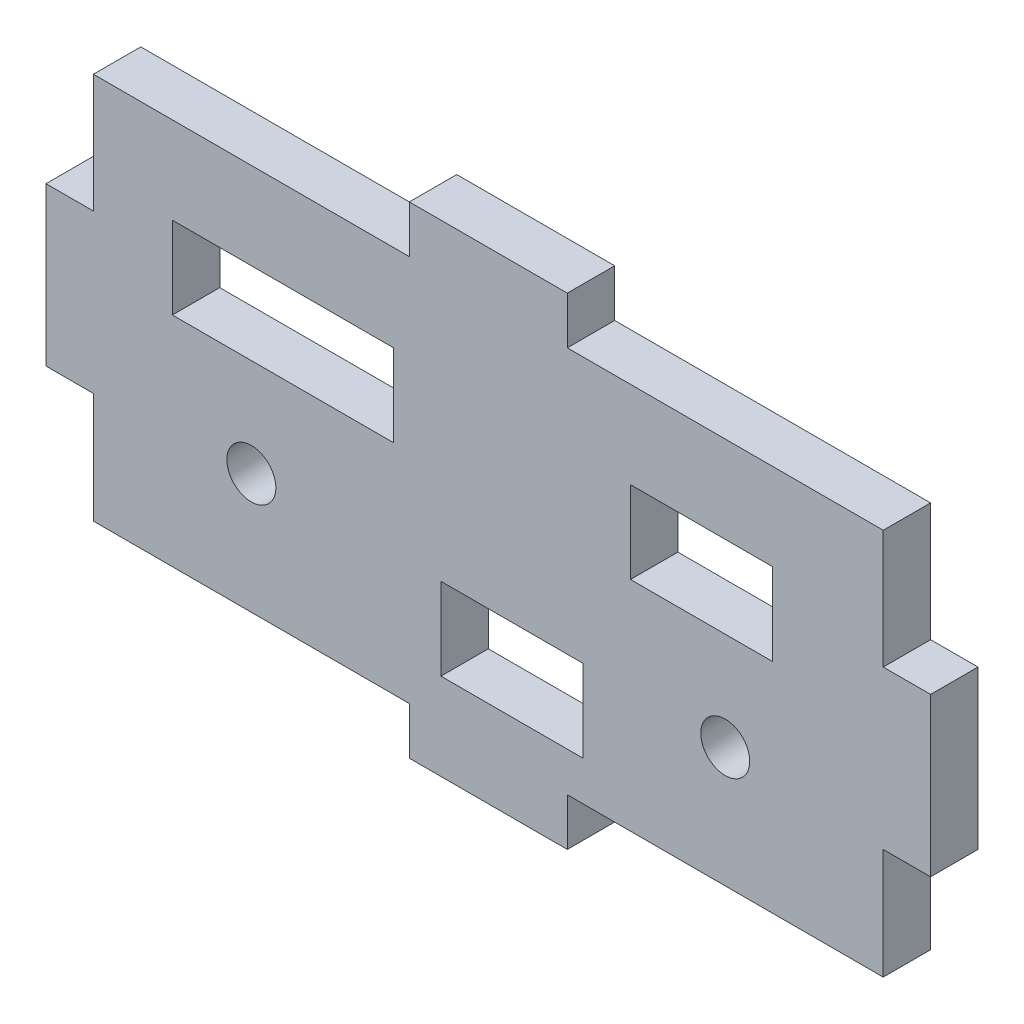
ISO-10303-21;
HEADER;
FILE_DESCRIPTION(('STEP AP214'),'2;1');
FILE_NAME('part.step','',(''),(''),'','','');
FILE_SCHEMA(('AUTOMOTIVE_DESIGN { 1 0 10303 214 1 1 1 1 }'));
ENDSEC;
DATA;
#1=APPLICATION_CONTEXT('core data for automotive mechanical design processes');
#2=APPLICATION_PROTOCOL_DEFINITION('international standard','automotive_design',2000,#1);
#3=PRODUCT_CONTEXT('',#1,'mechanical');
#4=PRODUCT('Part','Part','',(#3));
#5=PRODUCT_RELATED_PRODUCT_CATEGORY('part','',(#4));
#6=PRODUCT_DEFINITION_FORMATION('','',#4);
#7=PRODUCT_DEFINITION_CONTEXT('part definition',#1,'design');
#8=PRODUCT_DEFINITION('design','',#6,#7);
#9=PRODUCT_DEFINITION_SHAPE('','',#8);
#10=(LENGTH_UNIT() NAMED_UNIT(*) SI_UNIT(.MILLI.,.METRE.));
#11=(NAMED_UNIT(*) PLANE_ANGLE_UNIT() SI_UNIT($,.RADIAN.));
#12=(NAMED_UNIT(*) SI_UNIT($,.STERADIAN.) SOLID_ANGLE_UNIT());
#13=UNCERTAINTY_MEASURE_WITH_UNIT(LENGTH_MEASURE(1.E-05),#10,'distance_accuracy_value','');
#14=(GEOMETRIC_REPRESENTATION_CONTEXT(3) GLOBAL_UNCERTAINTY_ASSIGNED_CONTEXT((#13)) GLOBAL_UNIT_ASSIGNED_CONTEXT((#10,
#11,#12)) REPRESENTATION_CONTEXT('',''));
#15=CARTESIAN_POINT('',(0.,0.,0.));
#16=DIRECTION('',(0.,0.,1.));
#17=DIRECTION('',(1.,0.,0.));
#18=AXIS2_PLACEMENT_3D('',#15,#16,#17);
#19=CARTESIAN_POINT('',(3.47631815242721,7.83761556371931,3.));
#20=DIRECTION('',(0.,1.,0.));
#21=DIRECTION('',(-1.,0.,0.));
#22=AXIS2_PLACEMENT_3D('',#19,#20,#21);
#23=PLANE('',#22);
#24=DIRECTION('',(1.,0.,0.));
#25=VECTOR('',#24,1.);
#26=CARTESIAN_POINT('',(3.47631815242721,7.83761556371931,0.));
#27=LINE('',#26,#25);
#28=CARTESIAN_POINT('',(3.47631815242721,7.83761556371931,0.));
#29=VERTEX_POINT('',#28);
#30=CARTESIAN_POINT('',(23.4763181524272,7.83761556371931,0.));
#31=VERTEX_POINT('',#30);
#32=EDGE_CURVE('E351',#29,#31,#27,.T.);
#33=ORIENTED_EDGE('',*,*,#32,.T.);
#34=DIRECTION('',(0.,0.,-1.));
#35=VECTOR('',#34,1.);
#36=CARTESIAN_POINT('',(23.4763181524272,7.83761556371931,3.));
#37=LINE('',#36,#35);
#38=CARTESIAN_POINT('',(23.4763181524272,7.83761556371931,3.));
#39=VERTEX_POINT('',#38);
#40=EDGE_CURVE('E11',#39,#31,#37,.T.);
#41=ORIENTED_EDGE('',*,*,#40,.F.);
#42=DIRECTION('',(1.,0.,0.));
#43=VECTOR('',#42,1.);
#44=CARTESIAN_POINT('',(3.47631815242721,7.83761556371931,3.));
#45=LINE('',#44,#43);
#46=CARTESIAN_POINT('',(3.47631815242721,7.83761556371931,3.));
#47=VERTEX_POINT('',#46);
#48=EDGE_CURVE('E355',#47,#39,#45,.T.);
#49=ORIENTED_EDGE('',*,*,#48,.F.);
#50=DIRECTION('',(0.,0.,-1.));
#51=VECTOR('',#50,1.);
#52=CARTESIAN_POINT('',(3.47631815242721,7.83761556371931,3.));
#53=LINE('',#52,#51);
#54=EDGE_CURVE('E397',#47,#29,#53,.T.);
#55=ORIENTED_EDGE('',*,*,#54,.T.);
#56=EDGE_LOOP('',(#33,#41,#49,#55));
#57=FACE_BOUND('',#56,.T.);
#58=ADVANCED_FACE('F37',(#57),#23,.F.);
#59=CARTESIAN_POINT('',(23.4763181524272,7.83761556371931,3.));
#60=DIRECTION('',(-1.,0.,0.));
#61=DIRECTION('',(0.,0.,1.));
#62=AXIS2_PLACEMENT_3D('',#59,#60,#61);
#63=PLANE('',#62);
#64=DIRECTION('',(0.,1.,0.));
#65=VECTOR('',#64,1.);
#66=CARTESIAN_POINT('',(23.4763181524272,7.83761556371931,0.));
#67=LINE('',#66,#65);
#68=CARTESIAN_POINT('',(23.4763181524272,14.8376155637193,0.));
#69=VERTEX_POINT('',#68);
#70=EDGE_CURVE('E400',#31,#69,#67,.T.);
#71=ORIENTED_EDGE('',*,*,#70,.T.);
#72=DIRECTION('',(0.,0.,-1.));
#73=VECTOR('',#72,1.);
#74=CARTESIAN_POINT('',(23.4763181524272,14.8376155637193,3.));
#75=LINE('',#74,#73);
#76=CARTESIAN_POINT('',(23.4763181524272,14.8376155637193,3.));
#77=VERTEX_POINT('',#76);
#78=EDGE_CURVE('E44',#77,#69,#75,.T.);
#79=ORIENTED_EDGE('',*,*,#78,.F.);
#80=DIRECTION('',(0.,1.,0.));
#81=VECTOR('',#80,1.);
#82=CARTESIAN_POINT('',(23.4763181524272,7.83761556371931,3.));
#83=LINE('',#82,#81);
#84=EDGE_CURVE('E358',#39,#77,#83,.T.);
#85=ORIENTED_EDGE('',*,*,#84,.F.);
#86=ORIENTED_EDGE('',*,*,#40,.T.);
#87=EDGE_LOOP('',(#71,#79,#85,#86));
#88=FACE_BOUND('',#87,.T.);
#89=ADVANCED_FACE('F516',(#88),#63,.F.);
#90=CARTESIAN_POINT('',(23.4763181524272,14.8376155637193,3.));
#91=DIRECTION('',(0.,1.,0.));
#92=DIRECTION('',(0.,0.,1.));
#93=AXIS2_PLACEMENT_3D('',#90,#91,#92);
#94=PLANE('',#93);
#95=DIRECTION('',(1.,0.,0.));
#96=VECTOR('',#95,1.);
#97=CARTESIAN_POINT('',(23.4763181524272,14.8376155637193,0.));
#98=LINE('',#97,#96);
#99=CARTESIAN_POINT('',(26.4763181524272,14.8376155637193,0.));
#100=VERTEX_POINT('',#99);
#101=EDGE_CURVE('E402',#69,#100,#98,.T.);
#102=ORIENTED_EDGE('',*,*,#101,.T.);
#103=DIRECTION('',(0.,0.,-1.));
#104=VECTOR('',#103,1.);
#105=CARTESIAN_POINT('',(26.4763181524272,14.8376155637193,3.));
#106=LINE('',#105,#104);
#107=CARTESIAN_POINT('',(26.4763181524272,14.8376155637193,3.));
#108=VERTEX_POINT('',#107);
#109=EDGE_CURVE('E487',#108,#100,#106,.T.);
#110=ORIENTED_EDGE('',*,*,#109,.F.);
#111=DIRECTION('',(1.,0.,0.));
#112=VECTOR('',#111,1.);
#113=CARTESIAN_POINT('',(23.4763181524272,14.8376155637193,3.));
#114=LINE('',#113,#112);
#115=EDGE_CURVE('E361',#77,#108,#114,.T.);
#116=ORIENTED_EDGE('',*,*,#115,.F.);
#117=ORIENTED_EDGE('',*,*,#78,.T.);
#118=EDGE_LOOP('',(#102,#110,#116,#117));
#119=FACE_BOUND('',#118,.T.);
#120=ADVANCED_FACE('F494',(#119),#94,.F.);
#121=CARTESIAN_POINT('',(26.4763181524272,14.8376155637193,3.));
#122=DIRECTION('',(-1.,0.,0.));
#123=DIRECTION('',(0.,0.,1.));
#124=AXIS2_PLACEMENT_3D('',#121,#122,#123);
#125=PLANE('',#124);
#126=DIRECTION('',(0.,1.,0.));
#127=VECTOR('',#126,1.);
#128=CARTESIAN_POINT('',(26.4763181524272,14.8376155637193,0.));
#129=LINE('',#128,#127);
#130=CARTESIAN_POINT('',(26.4763181524272,24.8376155637193,0.));
#131=VERTEX_POINT('',#130);
#132=EDGE_CURVE('E404',#100,#131,#129,.T.);
#133=ORIENTED_EDGE('',*,*,#132,.T.);
#134=DIRECTION('',(0.,0.,-1.));
#135=VECTOR('',#134,1.);
#136=CARTESIAN_POINT('',(26.4763181524272,24.8376155637193,3.));
#137=LINE('',#136,#135);
#138=CARTESIAN_POINT('',(26.4763181524272,24.8376155637193,3.));
#139=VERTEX_POINT('',#138);
#140=EDGE_CURVE('E484',#139,#131,#137,.T.);
#141=ORIENTED_EDGE('',*,*,#140,.F.);
#142=DIRECTION('',(0.,1.,0.));
#143=VECTOR('',#142,1.);
#144=CARTESIAN_POINT('',(26.4763181524272,14.8376155637193,3.));
#145=LINE('',#144,#143);
#146=EDGE_CURVE('E363',#108,#139,#145,.T.);
#147=ORIENTED_EDGE('',*,*,#146,.F.);
#148=ORIENTED_EDGE('',*,*,#109,.T.);
#149=EDGE_LOOP('',(#133,#141,#147,#148));
#150=FACE_BOUND('',#149,.T.);
#151=ADVANCED_FACE('F505',(#150),#125,.F.);
#152=CARTESIAN_POINT('',(26.4763181524272,24.8376155637193,3.));
#153=DIRECTION('',(0.,-1.,0.));
#154=DIRECTION('',(0.,0.,-1.));
#155=AXIS2_PLACEMENT_3D('',#152,#153,#154);
#156=PLANE('',#155);
#157=DIRECTION('',(-1.,0.,0.));
#158=VECTOR('',#157,1.);
#159=CARTESIAN_POINT('',(26.4763181524272,24.8376155637193,0.));
#160=LINE('',#159,#158);
#161=CARTESIAN_POINT('',(23.4763181524272,24.8376155637193,0.));
#162=VERTEX_POINT('',#161);
#163=EDGE_CURVE('E406',#131,#162,#160,.T.);
#164=ORIENTED_EDGE('',*,*,#163,.T.);
#165=DIRECTION('',(0.,0.,-1.));
#166=VECTOR('',#165,1.);
#167=CARTESIAN_POINT('',(23.4763181524272,24.8376155637193,3.));
#168=LINE('',#167,#166);
#169=CARTESIAN_POINT('',(23.4763181524272,24.8376155637193,3.));
#170=VERTEX_POINT('',#169);
#171=EDGE_CURVE('E481',#170,#162,#168,.T.);
#172=ORIENTED_EDGE('',*,*,#171,.F.);
#173=DIRECTION('',(-1.,0.,0.));
#174=VECTOR('',#173,1.);
#175=CARTESIAN_POINT('',(26.4763181524272,24.8376155637193,3.));
#176=LINE('',#175,#174);
#177=EDGE_CURVE('E365',#139,#170,#176,.T.);
#178=ORIENTED_EDGE('',*,*,#177,.F.);
#179=ORIENTED_EDGE('',*,*,#140,.T.);
#180=EDGE_LOOP('',(#164,#172,#178,#179));
#181=FACE_BOUND('',#180,.T.);
#182=ADVANCED_FACE('F509',(#181),#156,.F.);
#183=CARTESIAN_POINT('',(23.4763181524272,24.8376155637193,3.));
#184=DIRECTION('',(-1.,0.,0.));
#185=DIRECTION('',(0.,0.,1.));
#186=AXIS2_PLACEMENT_3D('',#183,#184,#185);
#187=PLANE('',#186);
#188=DIRECTION('',(0.,1.,0.));
#189=VECTOR('',#188,1.);
#190=CARTESIAN_POINT('',(23.4763181524272,24.8376155637193,0.));
#191=LINE('',#190,#189);
#192=CARTESIAN_POINT('',(23.4763181524272,32.3376155637193,0.));
#193=VERTEX_POINT('',#192);
#194=EDGE_CURVE('E408',#162,#193,#191,.T.);
#195=ORIENTED_EDGE('',*,*,#194,.T.);
#196=DIRECTION('',(0.,0.,-1.));
#197=VECTOR('',#196,1.);
#198=CARTESIAN_POINT('',(23.4763181524272,32.3376155637193,3.));
#199=LINE('',#198,#197);
#200=CARTESIAN_POINT('',(23.4763181524272,32.3376155637193,3.));
#201=VERTEX_POINT('',#200);
#202=EDGE_CURVE('E478',#201,#193,#199,.T.);
#203=ORIENTED_EDGE('',*,*,#202,.F.);
#204=DIRECTION('',(0.,1.,0.));
#205=VECTOR('',#204,1.);
#206=CARTESIAN_POINT('',(23.4763181524272,24.8376155637193,3.));
#207=LINE('',#206,#205);
#208=EDGE_CURVE('E367',#170,#201,#207,.T.);
#209=ORIENTED_EDGE('',*,*,#208,.F.);
#210=ORIENTED_EDGE('',*,*,#171,.T.);
#211=EDGE_LOOP('',(#195,#203,#209,#210));
#212=FACE_BOUND('',#211,.T.);
#213=ADVANCED_FACE('F589',(#212),#187,.F.);
#214=CARTESIAN_POINT('',(3.47631815242721,32.3376155637193,3.));
#215=DIRECTION('',(0.,-1.,0.));
#216=DIRECTION('',(1.,0.,0.));
#217=AXIS2_PLACEMENT_3D('',#214,#215,#216);
#218=PLANE('',#217);
#219=DIRECTION('',(-1.,0.,0.));
#220=VECTOR('',#219,1.);
#221=CARTESIAN_POINT('',(3.47631815242721,32.3376155637193,0.));
#222=LINE('',#221,#220);
#223=CARTESIAN_POINT('',(3.47631815242721,32.3376155637193,0.));
#224=VERTEX_POINT('',#223);
#225=EDGE_CURVE('E410',#193,#224,#222,.T.);
#226=ORIENTED_EDGE('',*,*,#225,.T.);
#227=DIRECTION('',(0.,0.,-1.));
#228=VECTOR('',#227,1.);
#229=CARTESIAN_POINT('',(3.47631815242721,32.3376155637193,3.));
#230=LINE('',#229,#228);
#231=CARTESIAN_POINT('',(3.47631815242721,32.3376155637193,3.));
#232=VERTEX_POINT('',#231);
#233=EDGE_CURVE('E475',#232,#224,#230,.T.);
#234=ORIENTED_EDGE('',*,*,#233,.F.);
#235=DIRECTION('',(-1.,0.,0.));
#236=VECTOR('',#235,1.);
#237=CARTESIAN_POINT('',(3.47631815242721,32.3376155637193,3.));
#238=LINE('',#237,#236);
#239=EDGE_CURVE('E369',#201,#232,#238,.T.);
#240=ORIENTED_EDGE('',*,*,#239,.F.);
#241=ORIENTED_EDGE('',*,*,#202,.T.);
#242=EDGE_LOOP('',(#226,#234,#240,#241));
#243=FACE_BOUND('',#242,.T.);
#244=ADVANCED_FACE('F587',(#243),#218,.F.);
#245=CARTESIAN_POINT('',(3.47631815242721,32.3376155637193,3.));
#246=DIRECTION('',(-1.,0.,0.));
#247=DIRECTION('',(0.,0.,1.));
#248=AXIS2_PLACEMENT_3D('',#245,#246,#247);
#249=PLANE('',#248);
#250=DIRECTION('',(0.,1.,0.));
#251=VECTOR('',#250,1.);
#252=CARTESIAN_POINT('',(3.47631815242721,32.3376155637193,0.));
#253=LINE('',#252,#251);
#254=CARTESIAN_POINT('',(3.47631815242721,35.3376155637193,0.));
#255=VERTEX_POINT('',#254);
#256=EDGE_CURVE('E412',#224,#255,#253,.T.);
#257=ORIENTED_EDGE('',*,*,#256,.T.);
#258=DIRECTION('',(0.,0.,-1.));
#259=VECTOR('',#258,1.);
#260=CARTESIAN_POINT('',(3.47631815242721,35.3376155637193,3.));
#261=LINE('',#260,#259);
#262=CARTESIAN_POINT('',(3.47631815242721,35.3376155637193,3.));
#263=VERTEX_POINT('',#262);
#264=EDGE_CURVE('E472',#263,#255,#261,.T.);
#265=ORIENTED_EDGE('',*,*,#264,.F.);
#266=DIRECTION('',(0.,1.,0.));
#267=VECTOR('',#266,1.);
#268=CARTESIAN_POINT('',(3.47631815242721,32.3376155637193,3.));
#269=LINE('',#268,#267);
#270=EDGE_CURVE('E371',#232,#263,#269,.T.);
#271=ORIENTED_EDGE('',*,*,#270,.F.);
#272=ORIENTED_EDGE('',*,*,#233,.T.);
#273=EDGE_LOOP('',(#257,#265,#271,#272));
#274=FACE_BOUND('',#273,.T.);
#275=ADVANCED_FACE('F582',(#274),#249,.F.);
#276=CARTESIAN_POINT('',(3.47631815242721,35.3376155637193,3.));
#277=DIRECTION('',(0.,-1.,0.));
#278=DIRECTION('',(0.,0.,-1.));
#279=AXIS2_PLACEMENT_3D('',#276,#277,#278);
#280=PLANE('',#279);
#281=DIRECTION('',(-1.,0.,0.));
#282=VECTOR('',#281,1.);
#283=CARTESIAN_POINT('',(3.47631815242721,35.3376155637193,0.));
#284=LINE('',#283,#282);
#285=CARTESIAN_POINT('',(-6.52368184757279,35.3376155637193,0.));
#286=VERTEX_POINT('',#285);
#287=EDGE_CURVE('E414',#255,#286,#284,.T.);
#288=ORIENTED_EDGE('',*,*,#287,.T.);
#289=DIRECTION('',(0.,0.,-1.));
#290=VECTOR('',#289,1.);
#291=CARTESIAN_POINT('',(-6.52368184757279,35.3376155637193,3.));
#292=LINE('',#291,#290);
#293=CARTESIAN_POINT('',(-6.52368184757279,35.3376155637193,3.));
#294=VERTEX_POINT('',#293);
#295=EDGE_CURVE('E469',#294,#286,#292,.T.);
#296=ORIENTED_EDGE('',*,*,#295,.F.);
#297=DIRECTION('',(-1.,0.,0.));
#298=VECTOR('',#297,1.);
#299=CARTESIAN_POINT('',(3.47631815242721,35.3376155637193,3.));
#300=LINE('',#299,#298);
#301=EDGE_CURVE('E373',#263,#294,#300,.T.);
#302=ORIENTED_EDGE('',*,*,#301,.F.);
#303=ORIENTED_EDGE('',*,*,#264,.T.);
#304=EDGE_LOOP('',(#288,#296,#302,#303));
#305=FACE_BOUND('',#304,.T.);
#306=ADVANCED_FACE('F577',(#305),#280,.F.);
#307=CARTESIAN_POINT('',(-6.52368184757279,35.3376155637193,3.));
#308=DIRECTION('',(1.,0.,0.));
#309=DIRECTION('',(0.,0.,-1.));
#310=AXIS2_PLACEMENT_3D('',#307,#308,#309);
#311=PLANE('',#310);
#312=DIRECTION('',(0.,-1.,0.));
#313=VECTOR('',#312,1.);
#314=CARTESIAN_POINT('',(-6.52368184757279,35.3376155637193,0.));
#315=LINE('',#314,#313);
#316=CARTESIAN_POINT('',(-6.52368184757279,32.3376155637193,0.));
#317=VERTEX_POINT('',#316);
#318=EDGE_CURVE('E416',#286,#317,#315,.T.);
#319=ORIENTED_EDGE('',*,*,#318,.T.);
#320=DIRECTION('',(0.,0.,-1.));
#321=VECTOR('',#320,1.);
#322=CARTESIAN_POINT('',(-6.52368184757279,32.3376155637193,3.));
#323=LINE('',#322,#321);
#324=CARTESIAN_POINT('',(-6.52368184757279,32.3376155637193,3.));
#325=VERTEX_POINT('',#324);
#326=EDGE_CURVE('E466',#325,#317,#323,.T.);
#327=ORIENTED_EDGE('',*,*,#326,.F.);
#328=DIRECTION('',(0.,-1.,0.));
#329=VECTOR('',#328,1.);
#330=CARTESIAN_POINT('',(-6.52368184757279,35.3376155637193,3.));
#331=LINE('',#330,#329);
#332=EDGE_CURVE('E375',#294,#325,#331,.T.);
#333=ORIENTED_EDGE('',*,*,#332,.F.);
#334=ORIENTED_EDGE('',*,*,#295,.T.);
#335=EDGE_LOOP('',(#319,#327,#333,#334));
#336=FACE_BOUND('',#335,.T.);
#337=ADVANCED_FACE('F573',(#336),#311,.F.);
#338=CARTESIAN_POINT('',(-6.52368184757279,32.3376155637193,3.));
#339=DIRECTION('',(0.,-1.,0.));
#340=DIRECTION('',(1.,0.,0.));
#341=AXIS2_PLACEMENT_3D('',#338,#339,#340);
#342=PLANE('',#341);
#343=DIRECTION('',(-1.,0.,0.));
#344=VECTOR('',#343,1.);
#345=CARTESIAN_POINT('',(-6.52368184757279,32.3376155637193,0.));
#346=LINE('',#345,#344);
#347=CARTESIAN_POINT('',(-26.5236818475728,32.3376155637193,0.));
#348=VERTEX_POINT('',#347);
#349=EDGE_CURVE('E418',#317,#348,#346,.T.);
#350=ORIENTED_EDGE('',*,*,#349,.T.);
#351=DIRECTION('',(0.,0.,-1.));
#352=VECTOR('',#351,1.);
#353=CARTESIAN_POINT('',(-26.5236818475728,32.3376155637193,3.));
#354=LINE('',#353,#352);
#355=CARTESIAN_POINT('',(-26.5236818475728,32.3376155637193,3.));
#356=VERTEX_POINT('',#355);
#357=EDGE_CURVE('E463',#356,#348,#354,.T.);
#358=ORIENTED_EDGE('',*,*,#357,.F.);
#359=DIRECTION('',(-1.,0.,0.));
#360=VECTOR('',#359,1.);
#361=CARTESIAN_POINT('',(-6.52368184757279,32.3376155637193,3.));
#362=LINE('',#361,#360);
#363=EDGE_CURVE('E377',#325,#356,#362,.T.);
#364=ORIENTED_EDGE('',*,*,#363,.F.);
#365=ORIENTED_EDGE('',*,*,#326,.T.);
#366=EDGE_LOOP('',(#350,#358,#364,#365));
#367=FACE_BOUND('',#366,.T.);
#368=ADVANCED_FACE('F568',(#367),#342,.F.);
#369=CARTESIAN_POINT('',(-26.5236818475728,24.8376155637193,3.));
#370=DIRECTION('',(1.,0.,0.));
#371=DIRECTION('',(0.,0.,-1.));
#372=AXIS2_PLACEMENT_3D('',#369,#370,#371);
#373=PLANE('',#372);
#374=DIRECTION('',(0.,-1.,0.));
#375=VECTOR('',#374,1.);
#376=CARTESIAN_POINT('',(-26.5236818475728,24.8376155637193,0.));
#377=LINE('',#376,#375);
#378=CARTESIAN_POINT('',(-26.5236818475728,24.8376155637193,0.));
#379=VERTEX_POINT('',#378);
#380=EDGE_CURVE('E420',#348,#379,#377,.T.);
#381=ORIENTED_EDGE('',*,*,#380,.T.);
#382=DIRECTION('',(0.,0.,-1.));
#383=VECTOR('',#382,1.);
#384=CARTESIAN_POINT('',(-26.5236818475728,24.8376155637193,3.));
#385=LINE('',#384,#383);
#386=CARTESIAN_POINT('',(-26.5236818475728,24.8376155637193,3.));
#387=VERTEX_POINT('',#386);
#388=EDGE_CURVE('E460',#387,#379,#385,.T.);
#389=ORIENTED_EDGE('',*,*,#388,.F.);
#390=DIRECTION('',(0.,-1.,0.));
#391=VECTOR('',#390,1.);
#392=CARTESIAN_POINT('',(-26.5236818475728,24.8376155637193,3.));
#393=LINE('',#392,#391);
#394=EDGE_CURVE('E379',#356,#387,#393,.T.);
#395=ORIENTED_EDGE('',*,*,#394,.F.);
#396=ORIENTED_EDGE('',*,*,#357,.T.);
#397=EDGE_LOOP('',(#381,#389,#395,#396));
#398=FACE_BOUND('',#397,.T.);
#399=ADVANCED_FACE('F562',(#398),#373,.F.);
#400=CARTESIAN_POINT('',(-29.5236818475728,24.8376155637193,3.));
#401=DIRECTION('',(0.,-1.,0.));
#402=DIRECTION('',(0.,0.,-1.));
#403=AXIS2_PLACEMENT_3D('',#400,#401,#402);
#404=PLANE('',#403);
#405=DIRECTION('',(-1.,0.,0.));
#406=VECTOR('',#405,1.);
#407=CARTESIAN_POINT('',(-29.5236818475728,24.8376155637193,0.));
#408=LINE('',#407,#406);
#409=CARTESIAN_POINT('',(-29.5236818475728,24.8376155637193,0.));
#410=VERTEX_POINT('',#409);
#411=EDGE_CURVE('E422',#379,#410,#408,.T.);
#412=ORIENTED_EDGE('',*,*,#411,.T.);
#413=DIRECTION('',(0.,0.,-1.));
#414=VECTOR('',#413,1.);
#415=CARTESIAN_POINT('',(-29.5236818475728,24.8376155637193,3.));
#416=LINE('',#415,#414);
#417=CARTESIAN_POINT('',(-29.5236818475728,24.8376155637193,3.));
#418=VERTEX_POINT('',#417);
#419=EDGE_CURVE('E457',#418,#410,#416,.T.);
#420=ORIENTED_EDGE('',*,*,#419,.F.);
#421=DIRECTION('',(-1.,0.,0.));
#422=VECTOR('',#421,1.);
#423=CARTESIAN_POINT('',(-29.5236818475728,24.8376155637193,3.));
#424=LINE('',#423,#422);
#425=EDGE_CURVE('E381',#387,#418,#424,.T.);
#426=ORIENTED_EDGE('',*,*,#425,.F.);
#427=ORIENTED_EDGE('',*,*,#388,.T.);
#428=EDGE_LOOP('',(#412,#420,#426,#427));
#429=FACE_BOUND('',#428,.T.);
#430=ADVANCED_FACE('F558',(#429),#404,.F.);
#431=CARTESIAN_POINT('',(-29.5236818475728,14.8376155637193,3.));
#432=DIRECTION('',(1.,0.,0.));
#433=DIRECTION('',(0.,0.,-1.));
#434=AXIS2_PLACEMENT_3D('',#431,#432,#433);
#435=PLANE('',#434);
#436=DIRECTION('',(0.,-1.,0.));
#437=VECTOR('',#436,1.);
#438=CARTESIAN_POINT('',(-29.5236818475728,14.8376155637193,0.));
#439=LINE('',#438,#437);
#440=CARTESIAN_POINT('',(-29.5236818475728,14.8376155637193,0.));
#441=VERTEX_POINT('',#440);
#442=EDGE_CURVE('E424',#410,#441,#439,.T.);
#443=ORIENTED_EDGE('',*,*,#442,.T.);
#444=DIRECTION('',(0.,0.,-1.));
#445=VECTOR('',#444,1.);
#446=CARTESIAN_POINT('',(-29.5236818475728,14.8376155637193,3.));
#447=LINE('',#446,#445);
#448=CARTESIAN_POINT('',(-29.5236818475728,14.8376155637193,3.));
#449=VERTEX_POINT('',#448);
#450=EDGE_CURVE('E454',#449,#441,#447,.T.);
#451=ORIENTED_EDGE('',*,*,#450,.F.);
#452=DIRECTION('',(0.,-1.,0.));
#453=VECTOR('',#452,1.);
#454=CARTESIAN_POINT('',(-29.5236818475728,14.8376155637193,3.));
#455=LINE('',#454,#453);
#456=EDGE_CURVE('E383',#418,#449,#455,.T.);
#457=ORIENTED_EDGE('',*,*,#456,.F.);
#458=ORIENTED_EDGE('',*,*,#419,.T.);
#459=EDGE_LOOP('',(#443,#451,#457,#458));
#460=FACE_BOUND('',#459,.T.);
#461=ADVANCED_FACE('F553',(#460),#435,.F.);
#462=CARTESIAN_POINT('',(-26.5236818475728,14.8376155637193,3.));
#463=DIRECTION('',(0.,1.,0.));
#464=DIRECTION('',(0.,0.,1.));
#465=AXIS2_PLACEMENT_3D('',#462,#463,#464);
#466=PLANE('',#465);
#467=DIRECTION('',(1.,0.,0.));
#468=VECTOR('',#467,1.);
#469=CARTESIAN_POINT('',(-26.5236818475728,14.8376155637193,0.));
#470=LINE('',#469,#468);
#471=CARTESIAN_POINT('',(-26.5236818475728,14.8376155637193,0.));
#472=VERTEX_POINT('',#471);
#473=EDGE_CURVE('E426',#441,#472,#470,.T.);
#474=ORIENTED_EDGE('',*,*,#473,.T.);
#475=DIRECTION('',(0.,0.,-1.));
#476=VECTOR('',#475,1.);
#477=CARTESIAN_POINT('',(-26.5236818475728,14.8376155637193,3.));
#478=LINE('',#477,#476);
#479=CARTESIAN_POINT('',(-26.5236818475728,14.8376155637193,3.));
#480=VERTEX_POINT('',#479);
#481=EDGE_CURVE('E451',#480,#472,#478,.T.);
#482=ORIENTED_EDGE('',*,*,#481,.F.);
#483=DIRECTION('',(1.,0.,0.));
#484=VECTOR('',#483,1.);
#485=CARTESIAN_POINT('',(-26.5236818475728,14.8376155637193,3.));
#486=LINE('',#485,#484);
#487=EDGE_CURVE('E385',#449,#480,#486,.T.);
#488=ORIENTED_EDGE('',*,*,#487,.F.);
#489=ORIENTED_EDGE('',*,*,#450,.T.);
#490=EDGE_LOOP('',(#474,#482,#488,#489));
#491=FACE_BOUND('',#490,.T.);
#492=ADVANCED_FACE('F547',(#491),#466,.F.);
#493=CARTESIAN_POINT('',(-26.5236818475728,7.8376155637193,3.));
#494=DIRECTION('',(1.,0.,0.));
#495=DIRECTION('',(0.,0.,-1.));
#496=AXIS2_PLACEMENT_3D('',#493,#494,#495);
#497=PLANE('',#496);
#498=DIRECTION('',(0.,-1.,0.));
#499=VECTOR('',#498,1.);
#500=CARTESIAN_POINT('',(-26.5236818475728,7.8376155637193,0.));
#501=LINE('',#500,#499);
#502=CARTESIAN_POINT('',(-26.5236818475728,7.8376155637193,0.));
#503=VERTEX_POINT('',#502);
#504=EDGE_CURVE('E428',#472,#503,#501,.T.);
#505=ORIENTED_EDGE('',*,*,#504,.T.);
#506=DIRECTION('',(0.,0.,-1.));
#507=VECTOR('',#506,1.);
#508=CARTESIAN_POINT('',(-26.5236818475728,7.8376155637193,3.));
#509=LINE('',#508,#507);
#510=CARTESIAN_POINT('',(-26.5236818475728,7.8376155637193,3.));
#511=VERTEX_POINT('',#510);
#512=EDGE_CURVE('E448',#511,#503,#509,.T.);
#513=ORIENTED_EDGE('',*,*,#512,.F.);
#514=DIRECTION('',(0.,-1.,0.));
#515=VECTOR('',#514,1.);
#516=CARTESIAN_POINT('',(-26.5236818475728,7.8376155637193,3.));
#517=LINE('',#516,#515);
#518=EDGE_CURVE('E387',#480,#511,#517,.T.);
#519=ORIENTED_EDGE('',*,*,#518,.F.);
#520=ORIENTED_EDGE('',*,*,#481,.T.);
#521=EDGE_LOOP('',(#505,#513,#519,#520));
#522=FACE_BOUND('',#521,.T.);
#523=ADVANCED_FACE('F543',(#522),#497,.F.);
#524=CARTESIAN_POINT('',(-6.52368184757279,7.8376155637193,3.));
#525=DIRECTION('',(0.,1.,0.));
#526=DIRECTION('',(-1.,0.,0.));
#527=AXIS2_PLACEMENT_3D('',#524,#525,#526);
#528=PLANE('',#527);
#529=DIRECTION('',(1.,0.,0.));
#530=VECTOR('',#529,1.);
#531=CARTESIAN_POINT('',(-6.52368184757279,7.8376155637193,0.));
#532=LINE('',#531,#530);
#533=CARTESIAN_POINT('',(-6.52368184757279,7.8376155637193,0.));
#534=VERTEX_POINT('',#533);
#535=EDGE_CURVE('E430',#503,#534,#532,.T.);
#536=ORIENTED_EDGE('',*,*,#535,.T.);
#537=DIRECTION('',(0.,0.,-1.));
#538=VECTOR('',#537,1.);
#539=CARTESIAN_POINT('',(-6.52368184757279,7.8376155637193,3.));
#540=LINE('',#539,#538);
#541=CARTESIAN_POINT('',(-6.52368184757279,7.8376155637193,3.));
#542=VERTEX_POINT('',#541);
#543=EDGE_CURVE('E445',#542,#534,#540,.T.);
#544=ORIENTED_EDGE('',*,*,#543,.F.);
#545=DIRECTION('',(1.,0.,0.));
#546=VECTOR('',#545,1.);
#547=CARTESIAN_POINT('',(-6.52368184757279,7.8376155637193,3.));
#548=LINE('',#547,#546);
#549=EDGE_CURVE('E389',#511,#542,#548,.T.);
#550=ORIENTED_EDGE('',*,*,#549,.F.);
#551=ORIENTED_EDGE('',*,*,#512,.T.);
#552=EDGE_LOOP('',(#536,#544,#550,#551));
#553=FACE_BOUND('',#552,.T.);
#554=ADVANCED_FACE('F538',(#553),#528,.F.);
#555=CARTESIAN_POINT('',(-6.52368184757279,4.8376155637193,3.));
#556=DIRECTION('',(1.,0.,0.));
#557=DIRECTION('',(0.,0.,-1.));
#558=AXIS2_PLACEMENT_3D('',#555,#556,#557);
#559=PLANE('',#558);
#560=DIRECTION('',(0.,-1.,0.));
#561=VECTOR('',#560,1.);
#562=CARTESIAN_POINT('',(-6.52368184757279,4.8376155637193,0.));
#563=LINE('',#562,#561);
#564=CARTESIAN_POINT('',(-6.52368184757279,4.8376155637193,0.));
#565=VERTEX_POINT('',#564);
#566=EDGE_CURVE('E432',#534,#565,#563,.T.);
#567=ORIENTED_EDGE('',*,*,#566,.T.);
#568=DIRECTION('',(0.,0.,-1.));
#569=VECTOR('',#568,1.);
#570=CARTESIAN_POINT('',(-6.52368184757279,4.8376155637193,3.));
#571=LINE('',#570,#569);
#572=CARTESIAN_POINT('',(-6.52368184757279,4.8376155637193,3.));
#573=VERTEX_POINT('',#572);
#574=EDGE_CURVE('E442',#573,#565,#571,.T.);
#575=ORIENTED_EDGE('',*,*,#574,.F.);
#576=DIRECTION('',(0.,-1.,0.));
#577=VECTOR('',#576,1.);
#578=CARTESIAN_POINT('',(-6.52368184757279,4.8376155637193,3.));
#579=LINE('',#578,#577);
#580=EDGE_CURVE('E391',#542,#573,#579,.T.);
#581=ORIENTED_EDGE('',*,*,#580,.F.);
#582=ORIENTED_EDGE('',*,*,#543,.T.);
#583=EDGE_LOOP('',(#567,#575,#581,#582));
#584=FACE_BOUND('',#583,.T.);
#585=ADVANCED_FACE('F532',(#584),#559,.F.);
#586=CARTESIAN_POINT('',(3.47631815242721,4.83761556371931,3.));
#587=DIRECTION('',(0.,1.,0.));
#588=DIRECTION('',(-1.,0.,0.));
#589=AXIS2_PLACEMENT_3D('',#586,#587,#588);
#590=PLANE('',#589);
#591=DIRECTION('',(1.,0.,0.));
#592=VECTOR('',#591,1.);
#593=CARTESIAN_POINT('',(3.47631815242721,4.83761556371931,0.));
#594=LINE('',#593,#592);
#595=CARTESIAN_POINT('',(3.47631815242721,4.83761556371931,0.));
#596=VERTEX_POINT('',#595);
#597=EDGE_CURVE('E434',#565,#596,#594,.T.);
#598=ORIENTED_EDGE('',*,*,#597,.T.);
#599=DIRECTION('',(0.,0.,-1.));
#600=VECTOR('',#599,1.);
#601=CARTESIAN_POINT('',(3.47631815242721,4.83761556371931,3.));
#602=LINE('',#601,#600);
#603=CARTESIAN_POINT('',(3.47631815242721,4.83761556371931,3.));
#604=VERTEX_POINT('',#603);
#605=EDGE_CURVE('E439',#604,#596,#602,.T.);
#606=ORIENTED_EDGE('',*,*,#605,.F.);
#607=DIRECTION('',(1.,0.,0.));
#608=VECTOR('',#607,1.);
#609=CARTESIAN_POINT('',(3.47631815242721,4.83761556371931,3.));
#610=LINE('',#609,#608);
#611=EDGE_CURVE('E393',#573,#604,#610,.T.);
#612=ORIENTED_EDGE('',*,*,#611,.F.);
#613=ORIENTED_EDGE('',*,*,#574,.T.);
#614=EDGE_LOOP('',(#598,#606,#612,#613));
#615=FACE_BOUND('',#614,.T.);
#616=ADVANCED_FACE('F528',(#615),#590,.F.);
#617=CARTESIAN_POINT('',(3.47631815242721,7.83761556371931,3.));
#618=DIRECTION('',(-1.,0.,0.));
#619=DIRECTION('',(0.,0.,1.));
#620=AXIS2_PLACEMENT_3D('',#617,#618,#619);
#621=PLANE('',#620);
#622=DIRECTION('',(0.,1.,0.));
#623=VECTOR('',#622,1.);
#624=CARTESIAN_POINT('',(3.47631815242721,7.83761556371931,0.));
#625=LINE('',#624,#623);
#626=EDGE_CURVE('E359',#596,#29,#625,.T.);
#627=ORIENTED_EDGE('',*,*,#626,.T.);
#628=ORIENTED_EDGE('',*,*,#54,.F.);
#629=DIRECTION('',(0.,1.,0.));
#630=VECTOR('',#629,1.);
#631=CARTESIAN_POINT('',(3.47631815242721,7.83761556371931,3.));
#632=LINE('',#631,#630);
#633=EDGE_CURVE('E395',#604,#47,#632,.T.);
#634=ORIENTED_EDGE('',*,*,#633,.F.);
#635=ORIENTED_EDGE('',*,*,#605,.T.);
#636=EDGE_LOOP('',(#627,#628,#634,#635));
#637=FACE_BOUND('',#636,.T.);
#638=ADVANCED_FACE('F523',(#637),#621,.F.);
#639=CARTESIAN_POINT('',(0.,0.,3.));
#640=DIRECTION('',(0.,0.,1.));
#641=DIRECTION('',(1.,0.,0.));
#642=AXIS2_PLACEMENT_3D('',#639,#640,#641);
#643=PLANE('',#642);
#644=DIRECTION('',(0.,-1.,0.));
#645=VECTOR('',#644,1.);
#646=CARTESIAN_POINT('',(-21.5236818475728,26.8376155637193,3.));
#647=LINE('',#646,#645);
#648=CARTESIAN_POINT('',(-21.5236818475728,26.8376155637193,3.));
#649=VERTEX_POINT('',#648);
#650=CARTESIAN_POINT('',(-21.5236818475728,21.6376155637193,3.));
#651=VERTEX_POINT('',#650);
#652=EDGE_CURVE('E51',#649,#651,#647,.T.);
#653=ORIENTED_EDGE('',*,*,#652,.F.);
#654=DIRECTION('',(-1.,0.,0.));
#655=VECTOR('',#654,1.);
#656=CARTESIAN_POINT('',(-21.5236818475728,26.8376155637193,3.));
#657=LINE('',#656,#655);
#658=CARTESIAN_POINT('',(-7.52368184757279,26.8376155637193,3.));
#659=VERTEX_POINT('',#658);
#660=EDGE_CURVE('E327',#659,#649,#657,.T.);
#661=ORIENTED_EDGE('',*,*,#660,.F.);
#662=DIRECTION('',(0.,1.,0.));
#663=VECTOR('',#662,1.);
#664=CARTESIAN_POINT('',(-7.52368184757279,26.8376155637193,3.));
#665=LINE('',#664,#663);
#666=CARTESIAN_POINT('',(-7.52368184757279,21.6376155637193,3.));
#667=VERTEX_POINT('',#666);
#668=EDGE_CURVE('E330',#667,#659,#665,.T.);
#669=ORIENTED_EDGE('',*,*,#668,.F.);
#670=DIRECTION('',(1.,0.,0.));
#671=VECTOR('',#670,1.);
#672=CARTESIAN_POINT('',(-21.5236818475728,21.6376155637193,3.));
#673=LINE('',#672,#671);
#674=EDGE_CURVE('E334',#651,#667,#673,.T.);
#675=ORIENTED_EDGE('',*,*,#674,.F.);
#676=EDGE_LOOP('',(#653,#661,#669,#675));
#677=FACE_BOUND('',#676,.T.);
#678=DIRECTION('',(0.,-1.,0.));
#679=VECTOR('',#678,1.);
#680=CARTESIAN_POINT('',(7.47631815242721,26.8376155637193,3.));
#681=LINE('',#680,#679);
#682=CARTESIAN_POINT('',(7.47631815242721,26.8376155637193,3.));
#683=VERTEX_POINT('',#682);
#684=CARTESIAN_POINT('',(7.47631815242721,21.6376155637193,3.));
#685=VERTEX_POINT('',#684);
#686=EDGE_CURVE('E59',#683,#685,#681,.T.);
#687=ORIENTED_EDGE('',*,*,#686,.F.);
#688=DIRECTION('',(-1.,0.,0.));
#689=VECTOR('',#688,1.);
#690=CARTESIAN_POINT('',(7.47631815242721,26.8376155637193,3.));
#691=LINE('',#690,#689);
#692=CARTESIAN_POINT('',(16.4763181524272,26.8376155637193,3.));
#693=VERTEX_POINT('',#692);
#694=EDGE_CURVE('E297',#693,#683,#691,.T.);
#695=ORIENTED_EDGE('',*,*,#694,.F.);
#696=DIRECTION('',(0.,1.,0.));
#697=VECTOR('',#696,1.);
#698=CARTESIAN_POINT('',(16.4763181524272,26.8376155637193,3.));
#699=LINE('',#698,#697);
#700=CARTESIAN_POINT('',(16.4763181524272,21.6376155637193,3.));
#701=VERTEX_POINT('',#700);
#702=EDGE_CURVE('E300',#701,#693,#699,.T.);
#703=ORIENTED_EDGE('',*,*,#702,.F.);
#704=DIRECTION('',(1.,0.,0.));
#705=VECTOR('',#704,1.);
#706=CARTESIAN_POINT('',(7.47631815242721,21.6376155637193,3.));
#707=LINE('',#706,#705);
#708=EDGE_CURVE('E304',#685,#701,#707,.T.);
#709=ORIENTED_EDGE('',*,*,#708,.F.);
#710=EDGE_LOOP('',(#687,#695,#703,#709));
#711=FACE_BOUND('',#710,.T.);
#712=DIRECTION('',(0.,-1.,0.));
#713=VECTOR('',#712,1.);
#714=CARTESIAN_POINT('',(-4.52368184757279,15.5376155637193,3.));
#715=LINE('',#714,#713);
#716=CARTESIAN_POINT('',(-4.52368184757279,15.5376155637193,3.));
#717=VERTEX_POINT('',#716);
#718=CARTESIAN_POINT('',(-4.52368184757279,10.3376155637193,3.));
#719=VERTEX_POINT('',#718);
#720=EDGE_CURVE('E248',#717,#719,#715,.T.);
#721=ORIENTED_EDGE('',*,*,#720,.F.);
#722=DIRECTION('',(-1.,0.,0.));
#723=VECTOR('',#722,1.);
#724=CARTESIAN_POINT('',(-4.52368184757279,15.5376155637193,3.));
#725=LINE('',#724,#723);
#726=CARTESIAN_POINT('',(4.47631815242721,15.5376155637193,3.));
#727=VERTEX_POINT('',#726);
#728=EDGE_CURVE('E258',#727,#717,#725,.T.);
#729=ORIENTED_EDGE('',*,*,#728,.F.);
#730=DIRECTION('',(0.,1.,0.));
#731=VECTOR('',#730,1.);
#732=CARTESIAN_POINT('',(4.47631815242721,15.5376155637193,3.));
#733=LINE('',#732,#731);
#734=CARTESIAN_POINT('',(4.47631815242721,10.3376155637193,3.));
#735=VERTEX_POINT('',#734);
#736=EDGE_CURVE('E263',#735,#727,#733,.T.);
#737=ORIENTED_EDGE('',*,*,#736,.F.);
#738=DIRECTION('',(1.,0.,0.));
#739=VECTOR('',#738,1.);
#740=CARTESIAN_POINT('',(-4.52368184757279,10.3376155637193,3.));
#741=LINE('',#740,#739);
#742=EDGE_CURVE('E269',#719,#735,#741,.T.);
#743=ORIENTED_EDGE('',*,*,#742,.F.);
#744=EDGE_LOOP('',(#721,#729,#737,#743));
#745=FACE_BOUND('',#744,.T.);
#746=CARTESIAN_POINT('',(-16.5236818475728,15.4376155637193,3.));
#747=DIRECTION('',(0.,0.,1.));
#748=DIRECTION('',(-1.,0.,0.));
#749=AXIS2_PLACEMENT_3D('',#746,#747,#748);
#750=CIRCLE('',#749,1.55);
#751=CARTESIAN_POINT('',(-18.0736818475728,15.4376155637193,3.));
#752=VERTEX_POINT('',#751);
#753=EDGE_CURVE('E273',#752,#752,#750,.T.);
#754=ORIENTED_EDGE('',*,*,#753,.F.);
#755=EDGE_LOOP('',(#754));
#756=FACE_BOUND('',#755,.T.);
#757=CARTESIAN_POINT('',(13.4763181524272,15.4376155637193,3.));
#758=DIRECTION('',(0.,0.,1.));
#759=DIRECTION('',(1.,0.,0.));
#760=AXIS2_PLACEMENT_3D('',#757,#758,#759);
#761=CIRCLE('',#760,1.55);
#762=CARTESIAN_POINT('',(15.0263181524272,15.4376155637193,3.));
#763=VERTEX_POINT('',#762);
#764=EDGE_CURVE('E352',#763,#763,#761,.T.);
#765=ORIENTED_EDGE('',*,*,#764,.F.);
#766=EDGE_LOOP('',(#765));
#767=FACE_BOUND('',#766,.T.);
#768=ORIENTED_EDGE('',*,*,#48,.T.);
#769=ORIENTED_EDGE('',*,*,#84,.T.);
#770=ORIENTED_EDGE('',*,*,#115,.T.);
#771=ORIENTED_EDGE('',*,*,#146,.T.);
#772=ORIENTED_EDGE('',*,*,#177,.T.);
#773=ORIENTED_EDGE('',*,*,#208,.T.);
#774=ORIENTED_EDGE('',*,*,#239,.T.);
#775=ORIENTED_EDGE('',*,*,#270,.T.);
#776=ORIENTED_EDGE('',*,*,#301,.T.);
#777=ORIENTED_EDGE('',*,*,#332,.T.);
#778=ORIENTED_EDGE('',*,*,#363,.T.);
#779=ORIENTED_EDGE('',*,*,#394,.T.);
#780=ORIENTED_EDGE('',*,*,#425,.T.);
#781=ORIENTED_EDGE('',*,*,#456,.T.);
#782=ORIENTED_EDGE('',*,*,#487,.T.);
#783=ORIENTED_EDGE('',*,*,#518,.T.);
#784=ORIENTED_EDGE('',*,*,#549,.T.);
#785=ORIENTED_EDGE('',*,*,#580,.T.);
#786=ORIENTED_EDGE('',*,*,#611,.T.);
#787=ORIENTED_EDGE('',*,*,#633,.T.);
#788=EDGE_LOOP('',(#768,#769,#770,#771,#772,#773,#774,#775,#776,#777,#778,#779,#780,#781,#782,
#783,#784,#785,#786,#787));
#789=FACE_BOUND('',#788,.T.);
#790=ADVANCED_FACE('F266',(#677,#711,#745,#756,#767,#789),#643,.T.);
#791=CARTESIAN_POINT('',(0.,0.,0.));
#792=DIRECTION('',(0.,0.,1.));
#793=DIRECTION('',(1.,0.,0.));
#794=AXIS2_PLACEMENT_3D('',#791,#792,#793);
#795=PLANE('',#794);
#796=DIRECTION('',(-1.,0.,0.));
#797=VECTOR('',#796,1.);
#798=CARTESIAN_POINT('',(-21.5236818475728,26.8376155637193,0.));
#799=LINE('',#798,#797);
#800=CARTESIAN_POINT('',(-7.52368184757279,26.8376155637193,0.));
#801=VERTEX_POINT('',#800);
#802=CARTESIAN_POINT('',(-21.5236818475728,26.8376155637193,0.));
#803=VERTEX_POINT('',#802);
#804=EDGE_CURVE('E320',#801,#803,#799,.T.);
#805=ORIENTED_EDGE('',*,*,#804,.T.);
#806=DIRECTION('',(0.,-1.,0.));
#807=VECTOR('',#806,1.);
#808=CARTESIAN_POINT('',(-21.5236818475728,26.8376155637193,0.));
#809=LINE('',#808,#807);
#810=CARTESIAN_POINT('',(-21.5236818475728,21.6376155637193,0.));
#811=VERTEX_POINT('',#810);
#812=EDGE_CURVE('E331',#803,#811,#809,.T.);
#813=ORIENTED_EDGE('',*,*,#812,.T.);
#814=DIRECTION('',(1.,0.,0.));
#815=VECTOR('',#814,1.);
#816=CARTESIAN_POINT('',(-21.5236818475728,21.6376155637193,0.));
#817=LINE('',#816,#815);
#818=CARTESIAN_POINT('',(-7.52368184757279,21.6376155637193,0.));
#819=VERTEX_POINT('',#818);
#820=EDGE_CURVE('E343',#811,#819,#817,.T.);
#821=ORIENTED_EDGE('',*,*,#820,.T.);
#822=DIRECTION('',(0.,1.,0.));
#823=VECTOR('',#822,1.);
#824=CARTESIAN_POINT('',(-7.52368184757279,26.8376155637193,0.));
#825=LINE('',#824,#823);
#826=EDGE_CURVE('E340',#819,#801,#825,.T.);
#827=ORIENTED_EDGE('',*,*,#826,.T.);
#828=EDGE_LOOP('',(#805,#813,#821,#827));
#829=FACE_BOUND('',#828,.T.);
#830=DIRECTION('',(-1.,0.,0.));
#831=VECTOR('',#830,1.);
#832=CARTESIAN_POINT('',(7.47631815242721,26.8376155637193,0.));
#833=LINE('',#832,#831);
#834=CARTESIAN_POINT('',(16.4763181524272,26.8376155637193,0.));
#835=VERTEX_POINT('',#834);
#836=CARTESIAN_POINT('',(7.47631815242721,26.8376155637193,0.));
#837=VERTEX_POINT('',#836);
#838=EDGE_CURVE('E290',#835,#837,#833,.T.);
#839=ORIENTED_EDGE('',*,*,#838,.T.);
#840=DIRECTION('',(0.,-1.,0.));
#841=VECTOR('',#840,1.);
#842=CARTESIAN_POINT('',(7.47631815242721,26.8376155637193,0.));
#843=LINE('',#842,#841);
#844=CARTESIAN_POINT('',(7.47631815242721,21.6376155637193,0.));
#845=VERTEX_POINT('',#844);
#846=EDGE_CURVE('E301',#837,#845,#843,.T.);
#847=ORIENTED_EDGE('',*,*,#846,.T.);
#848=DIRECTION('',(1.,0.,0.));
#849=VECTOR('',#848,1.);
#850=CARTESIAN_POINT('',(7.47631815242721,21.6376155637193,0.));
#851=LINE('',#850,#849);
#852=CARTESIAN_POINT('',(16.4763181524272,21.6376155637193,0.));
#853=VERTEX_POINT('',#852);
#854=EDGE_CURVE('E313',#845,#853,#851,.T.);
#855=ORIENTED_EDGE('',*,*,#854,.T.);
#856=DIRECTION('',(0.,1.,0.));
#857=VECTOR('',#856,1.);
#858=CARTESIAN_POINT('',(16.4763181524272,26.8376155637193,0.));
#859=LINE('',#858,#857);
#860=EDGE_CURVE('E310',#853,#835,#859,.T.);
#861=ORIENTED_EDGE('',*,*,#860,.T.);
#862=EDGE_LOOP('',(#839,#847,#855,#861));
#863=FACE_BOUND('',#862,.T.);
#864=DIRECTION('',(-1.,0.,0.));
#865=VECTOR('',#864,1.);
#866=CARTESIAN_POINT('',(-4.52368184757279,15.5376155637193,0.));
#867=LINE('',#866,#865);
#868=CARTESIAN_POINT('',(4.47631815242721,15.5376155637193,0.));
#869=VERTEX_POINT('',#868);
#870=CARTESIAN_POINT('',(-4.52368184757279,15.5376155637193,0.));
#871=VERTEX_POINT('',#870);
#872=EDGE_CURVE('E278',#869,#871,#867,.T.);
#873=ORIENTED_EDGE('',*,*,#872,.T.);
#874=DIRECTION('',(0.,-1.,0.));
#875=VECTOR('',#874,1.);
#876=CARTESIAN_POINT('',(-4.52368184757279,15.5376155637193,0.));
#877=LINE('',#876,#875);
#878=CARTESIAN_POINT('',(-4.52368184757279,10.3376155637193,0.));
#879=VERTEX_POINT('',#878);
#880=EDGE_CURVE('E251',#871,#879,#877,.T.);
#881=ORIENTED_EDGE('',*,*,#880,.T.);
#882=DIRECTION('',(1.,0.,0.));
#883=VECTOR('',#882,1.);
#884=CARTESIAN_POINT('',(-4.52368184757279,10.3376155637193,0.));
#885=LINE('',#884,#883);
#886=CARTESIAN_POINT('',(4.47631815242721,10.3376155637193,0.));
#887=VERTEX_POINT('',#886);
#888=EDGE_CURVE('E284',#879,#887,#885,.T.);
#889=ORIENTED_EDGE('',*,*,#888,.T.);
#890=DIRECTION('',(0.,1.,0.));
#891=VECTOR('',#890,1.);
#892=CARTESIAN_POINT('',(4.47631815242721,15.5376155637193,0.));
#893=LINE('',#892,#891);
#894=EDGE_CURVE('E280',#887,#869,#893,.T.);
#895=ORIENTED_EDGE('',*,*,#894,.T.);
#896=EDGE_LOOP('',(#873,#881,#889,#895));
#897=FACE_BOUND('',#896,.T.);
#898=CARTESIAN_POINT('',(-16.5236818475728,15.4376155637193,0.));
#899=DIRECTION('',(0.,0.,1.));
#900=DIRECTION('',(-1.,0.,0.));
#901=AXIS2_PLACEMENT_3D('',#898,#899,#900);
#902=CIRCLE('',#901,1.55);
#903=CARTESIAN_POINT('',(-18.0736818475728,15.4376155637193,0.));
#904=VERTEX_POINT('',#903);
#905=EDGE_CURVE('E270',#904,#904,#902,.T.);
#906=ORIENTED_EDGE('',*,*,#905,.T.);
#907=EDGE_LOOP('',(#906));
#908=FACE_BOUND('',#907,.T.);
#909=CARTESIAN_POINT('',(13.4763181524272,15.4376155637193,0.));
#910=DIRECTION('',(0.,0.,1.));
#911=DIRECTION('',(1.,0.,0.));
#912=AXIS2_PLACEMENT_3D('',#909,#910,#911);
#913=CIRCLE('',#912,1.55);
#914=CARTESIAN_POINT('',(15.0263181524272,15.4376155637193,0.));
#915=VERTEX_POINT('',#914);
#916=EDGE_CURVE('E348',#915,#915,#913,.T.);
#917=ORIENTED_EDGE('',*,*,#916,.T.);
#918=EDGE_LOOP('',(#917));
#919=FACE_BOUND('',#918,.T.);
#920=ORIENTED_EDGE('',*,*,#32,.F.);
#921=ORIENTED_EDGE('',*,*,#626,.F.);
#922=ORIENTED_EDGE('',*,*,#597,.F.);
#923=ORIENTED_EDGE('',*,*,#566,.F.);
#924=ORIENTED_EDGE('',*,*,#535,.F.);
#925=ORIENTED_EDGE('',*,*,#504,.F.);
#926=ORIENTED_EDGE('',*,*,#473,.F.);
#927=ORIENTED_EDGE('',*,*,#442,.F.);
#928=ORIENTED_EDGE('',*,*,#411,.F.);
#929=ORIENTED_EDGE('',*,*,#380,.F.);
#930=ORIENTED_EDGE('',*,*,#349,.F.);
#931=ORIENTED_EDGE('',*,*,#318,.F.);
#932=ORIENTED_EDGE('',*,*,#287,.F.);
#933=ORIENTED_EDGE('',*,*,#256,.F.);
#934=ORIENTED_EDGE('',*,*,#225,.F.);
#935=ORIENTED_EDGE('',*,*,#194,.F.);
#936=ORIENTED_EDGE('',*,*,#163,.F.);
#937=ORIENTED_EDGE('',*,*,#132,.F.);
#938=ORIENTED_EDGE('',*,*,#101,.F.);
#939=ORIENTED_EDGE('',*,*,#70,.F.);
#940=EDGE_LOOP('',(#920,#921,#922,#923,#924,#925,#926,#927,#928,#929,#930,#931,#932,#933,#934,
#935,#936,#937,#938,#939));
#941=FACE_BOUND('',#940,.T.);
#942=ADVANCED_FACE('F500',(#829,#863,#897,#908,#919,#941),#795,.F.);
#943=CARTESIAN_POINT('',(13.4763181524272,15.4376155637193,0.));
#944=DIRECTION('',(0.,0.,1.));
#945=DIRECTION('',(1.,0.,0.));
#946=AXIS2_PLACEMENT_3D('',#943,#944,#945);
#947=CYLINDRICAL_SURFACE('',#946,1.55);
#948=ORIENTED_EDGE('',*,*,#916,.F.);
#949=EDGE_LOOP('',(#948));
#950=FACE_BOUND('',#949,.T.);
#951=ORIENTED_EDGE('',*,*,#764,.T.);
#952=EDGE_LOOP('',(#951));
#953=FACE_BOUND('',#952,.T.);
#954=ADVANCED_FACE('F765',(#950,#953),#947,.F.);
#955=CARTESIAN_POINT('',(-16.5236818475728,15.4376155637193,0.));
#956=DIRECTION('',(0.,0.,1.));
#957=DIRECTION('',(1.,0.,0.));
#958=AXIS2_PLACEMENT_3D('',#955,#956,#957);
#959=CYLINDRICAL_SURFACE('',#958,1.55);
#960=ORIENTED_EDGE('',*,*,#905,.F.);
#961=EDGE_LOOP('',(#960));
#962=FACE_BOUND('',#961,.T.);
#963=ORIENTED_EDGE('',*,*,#753,.T.);
#964=EDGE_LOOP('',(#963));
#965=FACE_BOUND('',#964,.T.);
#966=ADVANCED_FACE('F776',(#962,#965),#959,.F.);
#967=CARTESIAN_POINT('',(-4.52368184757279,15.5376155637193,0.));
#968=DIRECTION('',(-1.,0.,0.));
#969=DIRECTION('',(0.,0.,1.));
#970=AXIS2_PLACEMENT_3D('',#967,#968,#969);
#971=PLANE('',#970);
#972=ORIENTED_EDGE('',*,*,#720,.T.);
#973=DIRECTION('',(0.,0.,1.));
#974=VECTOR('',#973,1.);
#975=CARTESIAN_POINT('',(-4.52368184757279,10.3376155637193,0.));
#976=LINE('',#975,#974);
#977=EDGE_CURVE('E281',#879,#719,#976,.T.);
#978=ORIENTED_EDGE('',*,*,#977,.F.);
#979=ORIENTED_EDGE('',*,*,#880,.F.);
#980=DIRECTION('',(0.,0.,1.));
#981=VECTOR('',#980,1.);
#982=CARTESIAN_POINT('',(-4.52368184757279,15.5376155637193,0.));
#983=LINE('',#982,#981);
#984=EDGE_CURVE('E244',#871,#717,#983,.T.);
#985=ORIENTED_EDGE('',*,*,#984,.T.);
#986=EDGE_LOOP('',(#972,#978,#979,#985));
#987=FACE_BOUND('',#986,.T.);
#988=ADVANCED_FACE('F246',(#987),#971,.F.);
#989=CARTESIAN_POINT('',(-4.52368184757279,15.5376155637193,0.));
#990=DIRECTION('',(0.,1.,0.));
#991=DIRECTION('',(0.,0.,1.));
#992=AXIS2_PLACEMENT_3D('',#989,#990,#991);
#993=PLANE('',#992);
#994=ORIENTED_EDGE('',*,*,#728,.T.);
#995=ORIENTED_EDGE('',*,*,#984,.F.);
#996=ORIENTED_EDGE('',*,*,#872,.F.);
#997=DIRECTION('',(0.,0.,1.));
#998=VECTOR('',#997,1.);
#999=CARTESIAN_POINT('',(4.47631815242721,15.5376155637193,0.));
#1000=LINE('',#999,#998);
#1001=EDGE_CURVE('E255',#869,#727,#1000,.T.);
#1002=ORIENTED_EDGE('',*,*,#1001,.T.);
#1003=EDGE_LOOP('',(#994,#995,#996,#1002));
#1004=FACE_BOUND('',#1003,.T.);
#1005=ADVANCED_FACE('F259',(#1004),#993,.F.);
#1006=CARTESIAN_POINT('',(4.47631815242721,15.5376155637193,0.));
#1007=DIRECTION('',(1.,0.,0.));
#1008=DIRECTION('',(0.,0.,-1.));
#1009=AXIS2_PLACEMENT_3D('',#1006,#1007,#1008);
#1010=PLANE('',#1009);
#1011=ORIENTED_EDGE('',*,*,#736,.T.);
#1012=ORIENTED_EDGE('',*,*,#1001,.F.);
#1013=ORIENTED_EDGE('',*,*,#894,.F.);
#1014=DIRECTION('',(0.,0.,1.));
#1015=VECTOR('',#1014,1.);
#1016=CARTESIAN_POINT('',(4.47631815242721,10.3376155637193,0.));
#1017=LINE('',#1016,#1015);
#1018=EDGE_CURVE('E996',#887,#735,#1017,.T.);
#1019=ORIENTED_EDGE('',*,*,#1018,.T.);
#1020=EDGE_LOOP('',(#1011,#1012,#1013,#1019));
#1021=FACE_BOUND('',#1020,.T.);
#1022=ADVANCED_FACE('F806',(#1021),#1010,.F.);
#1023=CARTESIAN_POINT('',(-4.52368184757279,10.3376155637193,0.));
#1024=DIRECTION('',(0.,-1.,0.));
#1025=DIRECTION('',(0.,0.,-1.));
#1026=AXIS2_PLACEMENT_3D('',#1023,#1024,#1025);
#1027=PLANE('',#1026);
#1028=ORIENTED_EDGE('',*,*,#742,.T.);
#1029=ORIENTED_EDGE('',*,*,#1018,.F.);
#1030=ORIENTED_EDGE('',*,*,#888,.F.);
#1031=ORIENTED_EDGE('',*,*,#977,.T.);
#1032=EDGE_LOOP('',(#1028,#1029,#1030,#1031));
#1033=FACE_BOUND('',#1032,.T.);
#1034=ADVANCED_FACE('F816',(#1033),#1027,.F.);
#1035=CARTESIAN_POINT('',(7.47631815242721,26.8376155637193,0.));
#1036=DIRECTION('',(-1.,0.,0.));
#1037=DIRECTION('',(0.,0.,1.));
#1038=AXIS2_PLACEMENT_3D('',#1035,#1036,#1037);
#1039=PLANE('',#1038);
#1040=ORIENTED_EDGE('',*,*,#686,.T.);
#1041=DIRECTION('',(0.,0.,1.));
#1042=VECTOR('',#1041,1.);
#1043=CARTESIAN_POINT('',(7.47631815242721,21.6376155637193,0.));
#1044=LINE('',#1043,#1042);
#1045=EDGE_CURVE('E288',#845,#685,#1044,.T.);
#1046=ORIENTED_EDGE('',*,*,#1045,.F.);
#1047=ORIENTED_EDGE('',*,*,#846,.F.);
#1048=DIRECTION('',(0.,0.,1.));
#1049=VECTOR('',#1048,1.);
#1050=CARTESIAN_POINT('',(7.47631815242721,26.8376155637193,0.));
#1051=LINE('',#1050,#1049);
#1052=EDGE_CURVE('E295',#837,#683,#1051,.T.);
#1053=ORIENTED_EDGE('',*,*,#1052,.T.);
#1054=EDGE_LOOP('',(#1040,#1046,#1047,#1053));
#1055=FACE_BOUND('',#1054,.T.);
#1056=ADVANCED_FACE('F827',(#1055),#1039,.F.);
#1057=CARTESIAN_POINT('',(7.47631815242721,26.8376155637193,0.));
#1058=DIRECTION('',(0.,1.,0.));
#1059=DIRECTION('',(0.,0.,1.));
#1060=AXIS2_PLACEMENT_3D('',#1057,#1058,#1059);
#1061=PLANE('',#1060);
#1062=ORIENTED_EDGE('',*,*,#694,.T.);
#1063=ORIENTED_EDGE('',*,*,#1052,.F.);
#1064=ORIENTED_EDGE('',*,*,#838,.F.);
#1065=DIRECTION('',(0.,0.,1.));
#1066=VECTOR('',#1065,1.);
#1067=CARTESIAN_POINT('',(16.4763181524272,26.8376155637193,0.));
#1068=LINE('',#1067,#1066);
#1069=EDGE_CURVE('E293',#835,#693,#1068,.T.);
#1070=ORIENTED_EDGE('',*,*,#1069,.T.);
#1071=EDGE_LOOP('',(#1062,#1063,#1064,#1070));
#1072=FACE_BOUND('',#1071,.T.);
#1073=ADVANCED_FACE('F838',(#1072),#1061,.F.);
#1074=CARTESIAN_POINT('',(16.4763181524272,26.8376155637193,0.));
#1075=DIRECTION('',(1.,0.,0.));
#1076=DIRECTION('',(0.,0.,-1.));
#1077=AXIS2_PLACEMENT_3D('',#1074,#1075,#1076);
#1078=PLANE('',#1077);
#1079=ORIENTED_EDGE('',*,*,#702,.T.);
#1080=ORIENTED_EDGE('',*,*,#1069,.F.);
#1081=ORIENTED_EDGE('',*,*,#860,.F.);
#1082=DIRECTION('',(0.,0.,1.));
#1083=VECTOR('',#1082,1.);
#1084=CARTESIAN_POINT('',(16.4763181524272,21.6376155637193,0.));
#1085=LINE('',#1084,#1083);
#1086=EDGE_CURVE('E291',#853,#701,#1085,.T.);
#1087=ORIENTED_EDGE('',*,*,#1086,.T.);
#1088=EDGE_LOOP('',(#1079,#1080,#1081,#1087));
#1089=FACE_BOUND('',#1088,.T.);
#1090=ADVANCED_FACE('F848',(#1089),#1078,.F.);
#1091=CARTESIAN_POINT('',(7.47631815242721,21.6376155637193,0.));
#1092=DIRECTION('',(0.,-1.,0.));
#1093=DIRECTION('',(0.,0.,-1.));
#1094=AXIS2_PLACEMENT_3D('',#1091,#1092,#1093);
#1095=PLANE('',#1094);
#1096=ORIENTED_EDGE('',*,*,#708,.T.);
#1097=ORIENTED_EDGE('',*,*,#1086,.F.);
#1098=ORIENTED_EDGE('',*,*,#854,.F.);
#1099=ORIENTED_EDGE('',*,*,#1045,.T.);
#1100=EDGE_LOOP('',(#1096,#1097,#1098,#1099));
#1101=FACE_BOUND('',#1100,.T.);
#1102=ADVANCED_FACE('F859',(#1101),#1095,.F.);
#1103=CARTESIAN_POINT('',(-21.5236818475728,26.8376155637193,0.));
#1104=DIRECTION('',(-1.,0.,0.));
#1105=DIRECTION('',(0.,0.,1.));
#1106=AXIS2_PLACEMENT_3D('',#1103,#1104,#1105);
#1107=PLANE('',#1106);
#1108=ORIENTED_EDGE('',*,*,#652,.T.);
#1109=DIRECTION('',(0.,0.,1.));
#1110=VECTOR('',#1109,1.);
#1111=CARTESIAN_POINT('',(-21.5236818475728,21.6376155637193,0.));
#1112=LINE('',#1111,#1110);
#1113=EDGE_CURVE('E318',#811,#651,#1112,.T.);
#1114=ORIENTED_EDGE('',*,*,#1113,.F.);
#1115=ORIENTED_EDGE('',*,*,#812,.F.);
#1116=DIRECTION('',(0.,0.,1.));
#1117=VECTOR('',#1116,1.);
#1118=CARTESIAN_POINT('',(-21.5236818475728,26.8376155637193,0.));
#1119=LINE('',#1118,#1117);
#1120=EDGE_CURVE('E325',#803,#649,#1119,.T.);
#1121=ORIENTED_EDGE('',*,*,#1120,.T.);
#1122=EDGE_LOOP('',(#1108,#1114,#1115,#1121));
#1123=FACE_BOUND('',#1122,.T.);
#1124=ADVANCED_FACE('F870',(#1123),#1107,.F.);
#1125=CARTESIAN_POINT('',(-21.5236818475728,26.8376155637193,0.));
#1126=DIRECTION('',(0.,1.,0.));
#1127=DIRECTION('',(0.,0.,1.));
#1128=AXIS2_PLACEMENT_3D('',#1125,#1126,#1127);
#1129=PLANE('',#1128);
#1130=ORIENTED_EDGE('',*,*,#660,.T.);
#1131=ORIENTED_EDGE('',*,*,#1120,.F.);
#1132=ORIENTED_EDGE('',*,*,#804,.F.);
#1133=DIRECTION('',(0.,0.,1.));
#1134=VECTOR('',#1133,1.);
#1135=CARTESIAN_POINT('',(-7.52368184757279,26.8376155637193,0.));
#1136=LINE('',#1135,#1134);
#1137=EDGE_CURVE('E323',#801,#659,#1136,.T.);
#1138=ORIENTED_EDGE('',*,*,#1137,.T.);
#1139=EDGE_LOOP('',(#1130,#1131,#1132,#1138));
#1140=FACE_BOUND('',#1139,.T.);
#1141=ADVANCED_FACE('F881',(#1140),#1129,.F.);
#1142=CARTESIAN_POINT('',(-7.52368184757279,26.8376155637193,0.));
#1143=DIRECTION('',(1.,0.,0.));
#1144=DIRECTION('',(0.,0.,-1.));
#1145=AXIS2_PLACEMENT_3D('',#1142,#1143,#1144);
#1146=PLANE('',#1145);
#1147=ORIENTED_EDGE('',*,*,#668,.T.);
#1148=ORIENTED_EDGE('',*,*,#1137,.F.);
#1149=ORIENTED_EDGE('',*,*,#826,.F.);
#1150=DIRECTION('',(0.,0.,1.));
#1151=VECTOR('',#1150,1.);
#1152=CARTESIAN_POINT('',(-7.52368184757279,21.6376155637193,0.));
#1153=LINE('',#1152,#1151);
#1154=EDGE_CURVE('E321',#819,#667,#1153,.T.);
#1155=ORIENTED_EDGE('',*,*,#1154,.T.);
#1156=EDGE_LOOP('',(#1147,#1148,#1149,#1155));
#1157=FACE_BOUND('',#1156,.T.);
#1158=ADVANCED_FACE('F891',(#1157),#1146,.F.);
#1159=CARTESIAN_POINT('',(-21.5236818475728,21.6376155637193,0.));
#1160=DIRECTION('',(0.,-1.,0.));
#1161=DIRECTION('',(0.,0.,-1.));
#1162=AXIS2_PLACEMENT_3D('',#1159,#1160,#1161);
#1163=PLANE('',#1162);
#1164=ORIENTED_EDGE('',*,*,#674,.T.);
#1165=ORIENTED_EDGE('',*,*,#1154,.F.);
#1166=ORIENTED_EDGE('',*,*,#820,.F.);
#1167=ORIENTED_EDGE('',*,*,#1113,.T.);
#1168=EDGE_LOOP('',(#1164,#1165,#1166,#1167));
#1169=FACE_BOUND('',#1168,.T.);
#1170=ADVANCED_FACE('F902',(#1169),#1163,.F.);
#1171=CLOSED_SHELL('',(#58,#89,#120,#151,#182,#213,#244,#275,#306,#337,#368,#399,#430,#461,#492,
#523,#554,#585,#616,#638,#790,#942,#954,#966,#988,#1005,#1022,#1034,#1056,#1073,#1090,#1102,
#1124,#1141,#1158,#1170));
#1172=MANIFOLD_SOLID_BREP('B2',#1171);
#1173=ADVANCED_BREP_SHAPE_REPRESENTATION('',(#18,#1172),#14);
#1174=SHAPE_DEFINITION_REPRESENTATION(#9,#1173);
ENDSEC;
END-ISO-10303-21;
